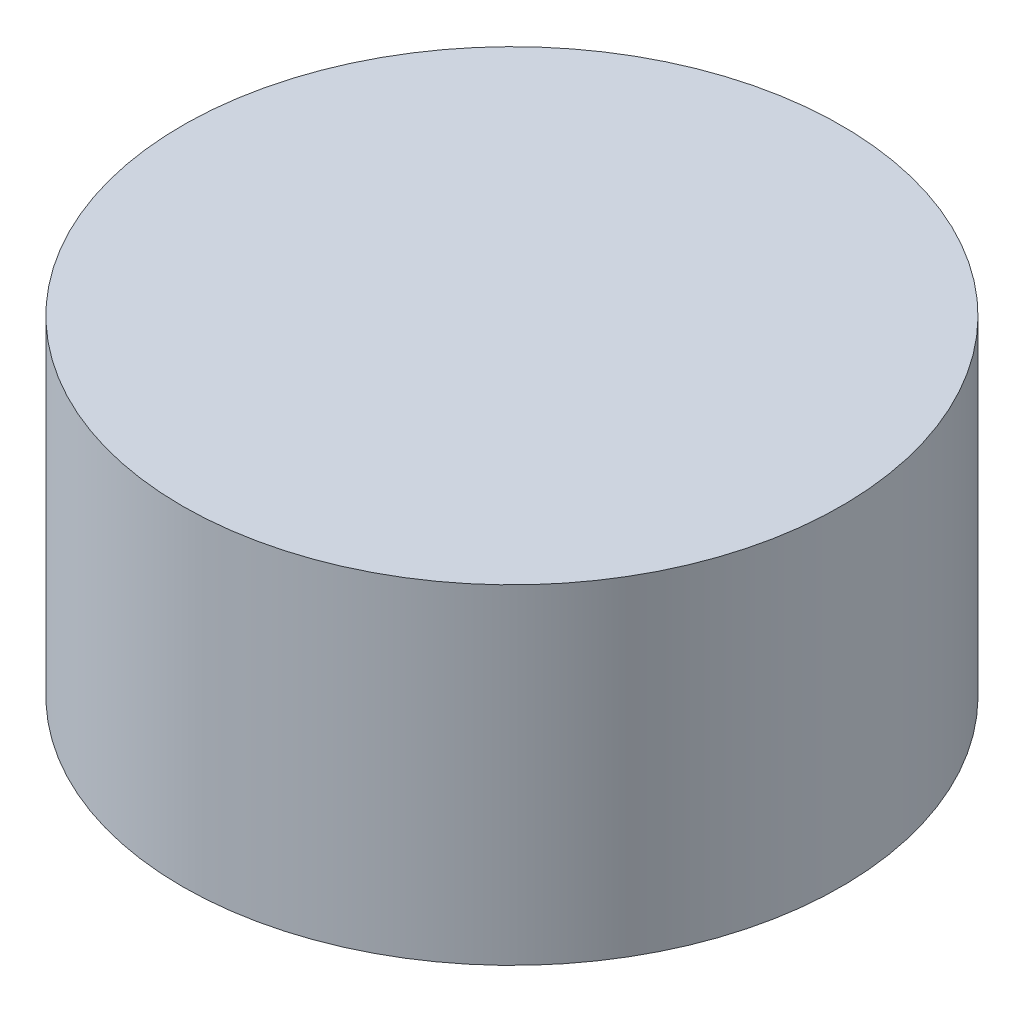
ISO-10303-21;
HEADER;
FILE_DESCRIPTION(('STEP AP214'),'2;1');
FILE_NAME('part.step','',(''),(''),'','','');
FILE_SCHEMA(('AUTOMOTIVE_DESIGN { 1 0 10303 214 1 1 1 1 }'));
ENDSEC;
DATA;
#1=APPLICATION_CONTEXT('core data for automotive mechanical design processes');
#2=APPLICATION_PROTOCOL_DEFINITION('international standard','automotive_design',2000,#1);
#3=PRODUCT_CONTEXT('',#1,'mechanical');
#4=PRODUCT('Part','Part','',(#3));
#5=PRODUCT_RELATED_PRODUCT_CATEGORY('part','',(#4));
#6=PRODUCT_DEFINITION_FORMATION('','',#4);
#7=PRODUCT_DEFINITION_CONTEXT('part definition',#1,'design');
#8=PRODUCT_DEFINITION('design','',#6,#7);
#9=PRODUCT_DEFINITION_SHAPE('','',#8);
#10=(LENGTH_UNIT() NAMED_UNIT(*) SI_UNIT(.MILLI.,.METRE.));
#11=(NAMED_UNIT(*) PLANE_ANGLE_UNIT() SI_UNIT($,.RADIAN.));
#12=(NAMED_UNIT(*) SI_UNIT($,.STERADIAN.) SOLID_ANGLE_UNIT());
#13=UNCERTAINTY_MEASURE_WITH_UNIT(LENGTH_MEASURE(1.E-05),#10,'distance_accuracy_value','');
#14=(GEOMETRIC_REPRESENTATION_CONTEXT(3) GLOBAL_UNCERTAINTY_ASSIGNED_CONTEXT((#13)) GLOBAL_UNIT_ASSIGNED_CONTEXT((#10,
#11,#12)) REPRESENTATION_CONTEXT('',''));
#15=CARTESIAN_POINT('',(0.,0.,0.));
#16=DIRECTION('',(0.,0.,1.));
#17=DIRECTION('',(1.,0.,0.));
#18=AXIS2_PLACEMENT_3D('',#15,#16,#17);
#19=CARTESIAN_POINT('',(0.,25.4,0.));
#20=DIRECTION('',(0.,-1.,0.));
#21=DIRECTION('',(0.,0.,-1.));
#22=AXIS2_PLACEMENT_3D('',#19,#20,#21);
#23=CYLINDRICAL_SURFACE('',#22,25.4);
#24=CARTESIAN_POINT('',(0.,25.4,0.));
#25=DIRECTION('',(0.,1.,0.));
#26=DIRECTION('',(0.,0.,1.));
#27=AXIS2_PLACEMENT_3D('',#24,#25,#26);
#28=CIRCLE('',#27,25.4);
#29=CARTESIAN_POINT('',(0.,25.4,25.4));
#30=VERTEX_POINT('',#29);
#31=EDGE_CURVE('E10',#30,#30,#28,.T.);
#32=ORIENTED_EDGE('',*,*,#31,.F.);
#33=EDGE_LOOP('',(#32));
#34=FACE_BOUND('',#33,.T.);
#35=CARTESIAN_POINT('',(0.,0.,0.));
#36=DIRECTION('',(0.,1.,0.));
#37=DIRECTION('',(0.,0.,1.));
#38=AXIS2_PLACEMENT_3D('',#35,#36,#37);
#39=CIRCLE('',#38,25.4);
#40=CARTESIAN_POINT('',(0.,0.,25.4));
#41=VERTEX_POINT('',#40);
#42=EDGE_CURVE('E40',#41,#41,#39,.T.);
#43=ORIENTED_EDGE('',*,*,#42,.T.);
#44=EDGE_LOOP('',(#43));
#45=FACE_BOUND('',#44,.T.);
#46=ADVANCED_FACE('F37',(#34,#45),#23,.T.);
#47=CARTESIAN_POINT('',(0.,25.4,0.));
#48=DIRECTION('',(0.,1.,0.));
#49=DIRECTION('',(0.,0.,1.));
#50=AXIS2_PLACEMENT_3D('',#47,#48,#49);
#51=PLANE('',#50);
#52=ORIENTED_EDGE('',*,*,#31,.T.);
#53=EDGE_LOOP('',(#52));
#54=FACE_BOUND('',#53,.T.);
#55=ADVANCED_FACE('F72',(#54),#51,.T.);
#56=CARTESIAN_POINT('',(0.,0.,0.));
#57=DIRECTION('',(0.,1.,0.));
#58=DIRECTION('',(0.,0.,1.));
#59=AXIS2_PLACEMENT_3D('',#56,#57,#58);
#60=PLANE('',#59);
#61=CARTESIAN_POINT('',(0.,0.,0.));
#62=DIRECTION('',(0.,1.,0.));
#63=DIRECTION('',(0.,0.,1.));
#64=AXIS2_PLACEMENT_3D('',#61,#62,#63);
#65=CIRCLE('',#64,22.86);
#66=CARTESIAN_POINT('',(0.,0.,22.86));
#67=VERTEX_POINT('',#66);
#68=EDGE_CURVE('E51',#67,#67,#65,.T.);
#69=ORIENTED_EDGE('',*,*,#68,.T.);
#70=EDGE_LOOP('',(#69));
#71=FACE_BOUND('',#70,.T.);
#72=ORIENTED_EDGE('',*,*,#42,.F.);
#73=EDGE_LOOP('',(#72));
#74=FACE_BOUND('',#73,.T.);
#75=ADVANCED_FACE('F68',(#71,#74),#60,.F.);
#76=CARTESIAN_POINT('',(0.,25.4,0.));
#77=DIRECTION('',(0.,-1.,0.));
#78=DIRECTION('',(0.,0.,-1.));
#79=AXIS2_PLACEMENT_3D('',#76,#77,#78);
#80=CYLINDRICAL_SURFACE('',#79,22.86);
#81=CARTESIAN_POINT('',(0.,22.86,0.));
#82=DIRECTION('',(0.,1.,0.));
#83=DIRECTION('',(0.,0.,1.));
#84=AXIS2_PLACEMENT_3D('',#81,#82,#83);
#85=CIRCLE('',#84,22.86);
#86=CARTESIAN_POINT('',(0.,22.86,22.86));
#87=VERTEX_POINT('',#86);
#88=EDGE_CURVE('E49',#87,#87,#85,.T.);
#89=ORIENTED_EDGE('',*,*,#88,.T.);
#90=EDGE_LOOP('',(#89));
#91=FACE_BOUND('',#90,.T.);
#92=ORIENTED_EDGE('',*,*,#68,.F.);
#93=EDGE_LOOP('',(#92));
#94=FACE_BOUND('',#93,.T.);
#95=ADVANCED_FACE('F59',(#91,#94),#80,.F.);
#96=CARTESIAN_POINT('',(0.,22.86,0.));
#97=DIRECTION('',(0.,1.,0.));
#98=DIRECTION('',(0.,0.,1.));
#99=AXIS2_PLACEMENT_3D('',#96,#97,#98);
#100=PLANE('',#99);
#101=ORIENTED_EDGE('',*,*,#88,.F.);
#102=EDGE_LOOP('',(#101));
#103=FACE_BOUND('',#102,.T.);
#104=ADVANCED_FACE('F62',(#103),#100,.F.);
#105=CLOSED_SHELL('',(#46,#55,#75,#95,#104));
#106=MANIFOLD_SOLID_BREP('B2',#105);
#107=ADVANCED_BREP_SHAPE_REPRESENTATION('',(#18,#106),#14);
#108=SHAPE_DEFINITION_REPRESENTATION(#9,#107);
ENDSEC;
END-ISO-10303-21;
